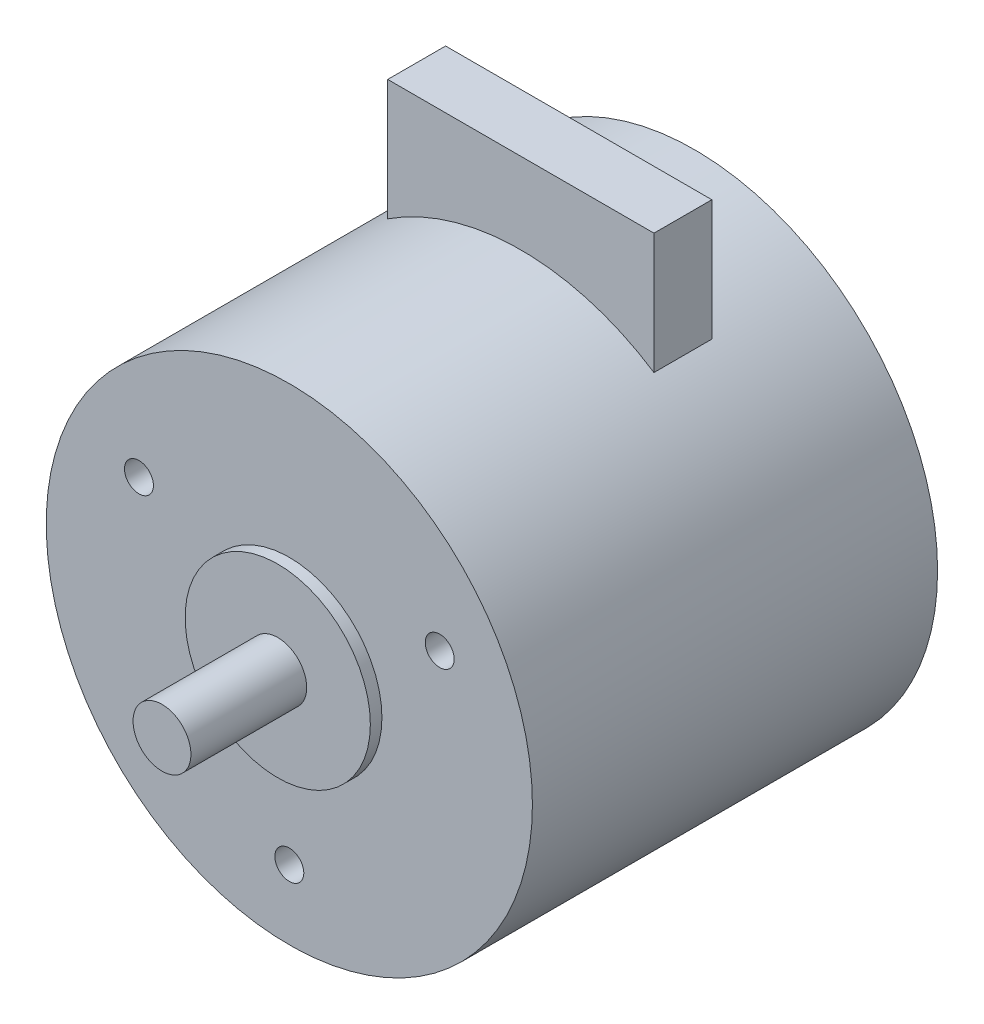
ISO-10303-21;
HEADER;
FILE_DESCRIPTION(('STEP AP214'),'2;1');
FILE_NAME('part.step','',(''),(''),'','','');
FILE_SCHEMA(('AUTOMOTIVE_DESIGN { 1 0 10303 214 1 1 1 1 }'));
ENDSEC;
DATA;
#1=APPLICATION_CONTEXT('core data for automotive mechanical design processes');
#2=APPLICATION_PROTOCOL_DEFINITION('international standard','automotive_design',2000,#1);
#3=PRODUCT_CONTEXT('',#1,'mechanical');
#4=PRODUCT('Part','Part','',(#3));
#5=PRODUCT_RELATED_PRODUCT_CATEGORY('part','',(#4));
#6=PRODUCT_DEFINITION_FORMATION('','',#4);
#7=PRODUCT_DEFINITION_CONTEXT('part definition',#1,'design');
#8=PRODUCT_DEFINITION('design','',#6,#7);
#9=PRODUCT_DEFINITION_SHAPE('','',#8);
#10=(LENGTH_UNIT() NAMED_UNIT(*) SI_UNIT(.MILLI.,.METRE.));
#11=(NAMED_UNIT(*) PLANE_ANGLE_UNIT() SI_UNIT($,.RADIAN.));
#12=(NAMED_UNIT(*) SI_UNIT($,.STERADIAN.) SOLID_ANGLE_UNIT());
#13=UNCERTAINTY_MEASURE_WITH_UNIT(LENGTH_MEASURE(1.E-05),#10,'distance_accuracy_value','');
#14=(GEOMETRIC_REPRESENTATION_CONTEXT(3) GLOBAL_UNCERTAINTY_ASSIGNED_CONTEXT((#13)) GLOBAL_UNIT_ASSIGNED_CONTEXT((#10,
#11,#12)) REPRESENTATION_CONTEXT('',''));
#15=CARTESIAN_POINT('',(0.,0.,0.));
#16=DIRECTION('',(0.,0.,1.));
#17=DIRECTION('',(1.,0.,0.));
#18=AXIS2_PLACEMENT_3D('',#15,#16,#17);
#19=CARTESIAN_POINT('',(0.,0.,35.));
#20=DIRECTION('',(0.,0.,-1.));
#21=DIRECTION('',(-1.,0.,0.));
#22=AXIS2_PLACEMENT_3D('',#19,#20,#21);
#23=CYLINDRICAL_SURFACE('',#22,21.);
#24=CARTESIAN_POINT('',(0.,0.,0.));
#25=DIRECTION('',(0.,0.,1.));
#26=DIRECTION('',(1.,0.,0.));
#27=AXIS2_PLACEMENT_3D('',#24,#25,#26);
#28=CIRCLE('',#27,21.);
#29=CARTESIAN_POINT('',(21.,0.,0.));
#30=VERTEX_POINT('',#29);
#31=EDGE_CURVE('E111',#30,#30,#28,.T.);
#32=ORIENTED_EDGE('',*,*,#31,.T.);
#33=EDGE_LOOP('',(#32));
#34=FACE_BOUND('',#33,.T.);
#35=CARTESIAN_POINT('',(0.,0.,35.));
#36=DIRECTION('',(0.,0.,1.));
#37=DIRECTION('',(1.,0.,0.));
#38=AXIS2_PLACEMENT_3D('',#35,#36,#37);
#39=CIRCLE('',#38,21.);
#40=CARTESIAN_POINT('',(21.,0.,35.));
#41=VERTEX_POINT('',#40);
#42=EDGE_CURVE('E114',#41,#41,#39,.T.);
#43=ORIENTED_EDGE('',*,*,#42,.F.);
#44=EDGE_LOOP('',(#43));
#45=FACE_BOUND('',#44,.T.);
#46=CARTESIAN_POINT('',(0.,0.,15.));
#47=DIRECTION('',(0.,0.,-1.));
#48=DIRECTION('',(-1.,0.,0.));
#49=AXIS2_PLACEMENT_3D('',#46,#47,#48);
#50=CIRCLE('',#49,21.);
#51=CARTESIAN_POINT('',(-11.5,17.5712833908056,15.));
#52=VERTEX_POINT('',#51);
#53=CARTESIAN_POINT('',(11.5,17.5712833908056,15.));
#54=VERTEX_POINT('',#53);
#55=EDGE_CURVE('E11',#52,#54,#50,.T.);
#56=ORIENTED_EDGE('',*,*,#55,.F.);
#57=DIRECTION('',(0.,0.,-1.));
#58=VECTOR('',#57,1.);
#59=CARTESIAN_POINT('',(-11.5,17.5712833908056,35.));
#60=LINE('',#59,#58);
#61=CARTESIAN_POINT('',(-11.5,17.5712833908056,10.));
#62=VERTEX_POINT('',#61);
#63=EDGE_CURVE('E54',#52,#62,#60,.T.);
#64=ORIENTED_EDGE('',*,*,#63,.T.);
#65=CARTESIAN_POINT('',(0.,0.,10.));
#66=DIRECTION('',(0.,0.,-1.));
#67=DIRECTION('',(-1.,0.,0.));
#68=AXIS2_PLACEMENT_3D('',#65,#66,#67);
#69=CIRCLE('',#68,21.);
#70=CARTESIAN_POINT('',(11.5,17.5712833908056,10.));
#71=VERTEX_POINT('',#70);
#72=EDGE_CURVE('E107',#62,#71,#69,.T.);
#73=ORIENTED_EDGE('',*,*,#72,.T.);
#74=DIRECTION('',(0.,0.,-1.));
#75=VECTOR('',#74,1.);
#76=CARTESIAN_POINT('',(11.5,17.5712833908056,35.));
#77=LINE('',#76,#75);
#78=EDGE_CURVE('E39',#71,#54,#77,.F.);
#79=ORIENTED_EDGE('',*,*,#78,.T.);
#80=EDGE_LOOP('',(#56,#64,#73,#79));
#81=FACE_BOUND('',#80,.T.);
#82=ADVANCED_FACE('F32',(#34,#45,#81),#23,.T.);
#83=CARTESIAN_POINT('',(0.,0.,35.));
#84=DIRECTION('',(0.,0.,1.));
#85=DIRECTION('',(1.,0.,0.));
#86=AXIS2_PLACEMENT_3D('',#83,#84,#85);
#87=PLANE('',#86);
#88=CARTESIAN_POINT('',(1.04744440165294E-13,-15.,35.));
#89=DIRECTION('',(0.,0.,1.));
#90=DIRECTION('',(1.,0.,0.));
#91=AXIS2_PLACEMENT_3D('',#88,#89,#90);
#92=CIRCLE('',#91,1.25);
#93=CARTESIAN_POINT('',(1.2500000000001,-15.,35.));
#94=VERTEX_POINT('',#93);
#95=EDGE_CURVE('E138',#94,#94,#92,.T.);
#96=ORIENTED_EDGE('',*,*,#95,.F.);
#97=EDGE_LOOP('',(#96));
#98=FACE_BOUND('',#97,.T.);
#99=CARTESIAN_POINT('',(-12.9903810567657,7.50000000000046,35.));
#100=DIRECTION('',(0.,0.,1.));
#101=DIRECTION('',(1.,0.,0.));
#102=AXIS2_PLACEMENT_3D('',#99,#100,#101);
#103=CIRCLE('',#102,1.24999999999932);
#104=CARTESIAN_POINT('',(-11.7403810567664,7.50000000000046,35.));
#105=VERTEX_POINT('',#104);
#106=EDGE_CURVE('E132',#105,#105,#103,.T.);
#107=ORIENTED_EDGE('',*,*,#106,.F.);
#108=EDGE_LOOP('',(#107));
#109=FACE_BOUND('',#108,.T.);
#110=CARTESIAN_POINT('',(12.9903810567675,7.49999999999955,35.));
#111=DIRECTION('',(0.,0.,1.));
#112=DIRECTION('',(1.,0.,0.));
#113=AXIS2_PLACEMENT_3D('',#110,#111,#112);
#114=CIRCLE('',#113,1.24999999999907);
#115=CARTESIAN_POINT('',(14.2403810567665,7.49999999999955,35.));
#116=VERTEX_POINT('',#115);
#117=EDGE_CURVE('E126',#116,#116,#114,.T.);
#118=ORIENTED_EDGE('',*,*,#117,.F.);
#119=EDGE_LOOP('',(#118));
#120=FACE_BOUND('',#119,.T.);
#121=CARTESIAN_POINT('',(0.,0.,35.));
#122=DIRECTION('',(0.,0.,1.));
#123=DIRECTION('',(1.,0.,0.));
#124=AXIS2_PLACEMENT_3D('',#121,#122,#123);
#125=CIRCLE('',#124,8.);
#126=CARTESIAN_POINT('',(8.,0.,35.));
#127=VERTEX_POINT('',#126);
#128=EDGE_CURVE('E108',#127,#127,#125,.T.);
#129=ORIENTED_EDGE('',*,*,#128,.F.);
#130=EDGE_LOOP('',(#129));
#131=FACE_BOUND('',#130,.T.);
#132=ORIENTED_EDGE('',*,*,#42,.T.);
#133=EDGE_LOOP('',(#132));
#134=FACE_BOUND('',#133,.T.);
#135=ADVANCED_FACE('F153',(#98,#109,#120,#131,#134),#87,.T.);
#136=CARTESIAN_POINT('',(0.,0.,0.));
#137=DIRECTION('',(0.,0.,1.));
#138=DIRECTION('',(1.,0.,0.));
#139=AXIS2_PLACEMENT_3D('',#136,#137,#138);
#140=PLANE('',#139);
#141=ORIENTED_EDGE('',*,*,#31,.F.);
#142=EDGE_LOOP('',(#141));
#143=FACE_BOUND('',#142,.T.);
#144=ADVANCED_FACE('F156',(#143),#140,.F.);
#145=CARTESIAN_POINT('',(0.,0.,36.));
#146=DIRECTION('',(0.,0.,-1.));
#147=DIRECTION('',(-1.,0.,0.));
#148=AXIS2_PLACEMENT_3D('',#145,#146,#147);
#149=CYLINDRICAL_SURFACE('',#148,8.);
#150=CARTESIAN_POINT('',(0.,0.,36.));
#151=DIRECTION('',(0.,0.,1.));
#152=DIRECTION('',(1.,0.,0.));
#153=AXIS2_PLACEMENT_3D('',#150,#151,#152);
#154=CIRCLE('',#153,8.);
#155=CARTESIAN_POINT('',(8.,0.,36.));
#156=VERTEX_POINT('',#155);
#157=EDGE_CURVE('E103',#156,#156,#154,.T.);
#158=ORIENTED_EDGE('',*,*,#157,.F.);
#159=EDGE_LOOP('',(#158));
#160=FACE_BOUND('',#159,.T.);
#161=ORIENTED_EDGE('',*,*,#128,.T.);
#162=EDGE_LOOP('',(#161));
#163=FACE_BOUND('',#162,.T.);
#164=ADVANCED_FACE('F174',(#160,#163),#149,.T.);
#165=CARTESIAN_POINT('',(0.,0.,36.));
#166=DIRECTION('',(0.,0.,1.));
#167=DIRECTION('',(1.,0.,0.));
#168=AXIS2_PLACEMENT_3D('',#165,#166,#167);
#169=PLANE('',#168);
#170=CARTESIAN_POINT('',(0.,0.,36.));
#171=DIRECTION('',(0.,0.,1.));
#172=DIRECTION('',(1.,0.,0.));
#173=AXIS2_PLACEMENT_3D('',#170,#171,#172);
#174=CIRCLE('',#173,2.5);
#175=CARTESIAN_POINT('',(2.5,0.,36.));
#176=VERTEX_POINT('',#175);
#177=EDGE_CURVE('E104',#176,#176,#174,.T.);
#178=ORIENTED_EDGE('',*,*,#177,.F.);
#179=EDGE_LOOP('',(#178));
#180=FACE_BOUND('',#179,.T.);
#181=ORIENTED_EDGE('',*,*,#157,.T.);
#182=EDGE_LOOP('',(#181));
#183=FACE_BOUND('',#182,.T.);
#184=ADVANCED_FACE('F178',(#180,#183),#169,.T.);
#185=CARTESIAN_POINT('',(0.,0.,46.));
#186=DIRECTION('',(0.,0.,-1.));
#187=DIRECTION('',(-1.,0.,0.));
#188=AXIS2_PLACEMENT_3D('',#185,#186,#187);
#189=CYLINDRICAL_SURFACE('',#188,2.5);
#190=CARTESIAN_POINT('',(0.,0.,46.));
#191=DIRECTION('',(0.,0.,1.));
#192=DIRECTION('',(1.,0.,0.));
#193=AXIS2_PLACEMENT_3D('',#190,#191,#192);
#194=CIRCLE('',#193,2.5);
#195=CARTESIAN_POINT('',(2.5,0.,46.));
#196=VERTEX_POINT('',#195);
#197=EDGE_CURVE('E99',#196,#196,#194,.T.);
#198=ORIENTED_EDGE('',*,*,#197,.F.);
#199=EDGE_LOOP('',(#198));
#200=FACE_BOUND('',#199,.T.);
#201=ORIENTED_EDGE('',*,*,#177,.T.);
#202=EDGE_LOOP('',(#201));
#203=FACE_BOUND('',#202,.T.);
#204=ADVANCED_FACE('F184',(#200,#203),#189,.T.);
#205=CARTESIAN_POINT('',(0.,0.,46.));
#206=DIRECTION('',(0.,0.,1.));
#207=DIRECTION('',(1.,0.,0.));
#208=AXIS2_PLACEMENT_3D('',#205,#206,#207);
#209=PLANE('',#208);
#210=ORIENTED_EDGE('',*,*,#197,.T.);
#211=EDGE_LOOP('',(#210));
#212=FACE_BOUND('',#211,.T.);
#213=ADVANCED_FACE('F188',(#212),#209,.T.);
#214=CARTESIAN_POINT('',(11.5,28.,15.));
#215=DIRECTION('',(1.,0.,0.));
#216=DIRECTION('',(0.,1.,0.));
#217=AXIS2_PLACEMENT_3D('',#214,#215,#216);
#218=PLANE('',#217);
#219=ORIENTED_EDGE('',*,*,#78,.F.);
#220=DIRECTION('',(0.,-1.,0.));
#221=VECTOR('',#220,1.);
#222=CARTESIAN_POINT('',(11.5,28.,10.));
#223=LINE('',#222,#221);
#224=CARTESIAN_POINT('',(11.5,28.,10.));
#225=VERTEX_POINT('',#224);
#226=EDGE_CURVE('E46',#225,#71,#223,.T.);
#227=ORIENTED_EDGE('',*,*,#226,.F.);
#228=DIRECTION('',(0.,0.,-1.));
#229=VECTOR('',#228,1.);
#230=CARTESIAN_POINT('',(11.5,28.,15.));
#231=LINE('',#230,#229);
#232=CARTESIAN_POINT('',(11.5,28.,15.));
#233=VERTEX_POINT('',#232);
#234=EDGE_CURVE('E86',#233,#225,#231,.T.);
#235=ORIENTED_EDGE('',*,*,#234,.F.);
#236=DIRECTION('',(0.,-1.,0.));
#237=VECTOR('',#236,1.);
#238=CARTESIAN_POINT('',(11.5,28.,15.));
#239=LINE('',#238,#237);
#240=EDGE_CURVE('E80',#233,#54,#239,.T.);
#241=ORIENTED_EDGE('',*,*,#240,.T.);
#242=EDGE_LOOP('',(#219,#227,#235,#241));
#243=FACE_BOUND('',#242,.T.);
#244=ADVANCED_FACE('F124',(#243),#218,.T.);
#245=CARTESIAN_POINT('',(-11.5,28.,15.));
#246=DIRECTION('',(-1.,0.,0.));
#247=DIRECTION('',(0.,-1.,0.));
#248=AXIS2_PLACEMENT_3D('',#245,#246,#247);
#249=PLANE('',#248);
#250=ORIENTED_EDGE('',*,*,#63,.F.);
#251=DIRECTION('',(0.,1.,0.));
#252=VECTOR('',#251,1.);
#253=CARTESIAN_POINT('',(-11.5,28.,15.));
#254=LINE('',#253,#252);
#255=CARTESIAN_POINT('',(-11.5,28.,15.));
#256=VERTEX_POINT('',#255);
#257=EDGE_CURVE('E71',#52,#256,#254,.T.);
#258=ORIENTED_EDGE('',*,*,#257,.T.);
#259=DIRECTION('',(0.,0.,-1.));
#260=VECTOR('',#259,1.);
#261=CARTESIAN_POINT('',(-11.5,28.,15.));
#262=LINE('',#261,#260);
#263=CARTESIAN_POINT('',(-11.5,28.,10.));
#264=VERTEX_POINT('',#263);
#265=EDGE_CURVE('E74',#256,#264,#262,.T.);
#266=ORIENTED_EDGE('',*,*,#265,.T.);
#267=DIRECTION('',(0.,1.,0.));
#268=VECTOR('',#267,1.);
#269=CARTESIAN_POINT('',(-11.5,28.,10.));
#270=LINE('',#269,#268);
#271=EDGE_CURVE('E95',#62,#264,#270,.T.);
#272=ORIENTED_EDGE('',*,*,#271,.F.);
#273=EDGE_LOOP('',(#250,#258,#266,#272));
#274=FACE_BOUND('',#273,.T.);
#275=ADVANCED_FACE('F73',(#274),#249,.T.);
#276=CARTESIAN_POINT('',(11.5,28.,15.));
#277=DIRECTION('',(0.,1.,0.));
#278=DIRECTION('',(0.,0.,1.));
#279=AXIS2_PLACEMENT_3D('',#276,#277,#278);
#280=PLANE('',#279);
#281=DIRECTION('',(1.,0.,0.));
#282=VECTOR('',#281,1.);
#283=CARTESIAN_POINT('',(11.5,28.,10.));
#284=LINE('',#283,#282);
#285=EDGE_CURVE('E85',#264,#225,#284,.T.);
#286=ORIENTED_EDGE('',*,*,#285,.F.);
#287=ORIENTED_EDGE('',*,*,#265,.F.);
#288=DIRECTION('',(1.,0.,0.));
#289=VECTOR('',#288,1.);
#290=CARTESIAN_POINT('',(11.5,28.,15.));
#291=LINE('',#290,#289);
#292=EDGE_CURVE('E79',#256,#233,#291,.T.);
#293=ORIENTED_EDGE('',*,*,#292,.T.);
#294=ORIENTED_EDGE('',*,*,#234,.T.);
#295=EDGE_LOOP('',(#286,#287,#293,#294));
#296=FACE_BOUND('',#295,.T.);
#297=ADVANCED_FACE('F84',(#296),#280,.T.);
#298=CARTESIAN_POINT('',(0.,0.,15.));
#299=DIRECTION('',(0.,0.,-1.));
#300=DIRECTION('',(-1.,0.,0.));
#301=AXIS2_PLACEMENT_3D('',#298,#299,#300);
#302=PLANE('',#301);
#303=ORIENTED_EDGE('',*,*,#257,.F.);
#304=ORIENTED_EDGE('',*,*,#55,.T.);
#305=ORIENTED_EDGE('',*,*,#240,.F.);
#306=ORIENTED_EDGE('',*,*,#292,.F.);
#307=EDGE_LOOP('',(#303,#304,#305,#306));
#308=FACE_BOUND('',#307,.T.);
#309=ADVANCED_FACE('F89',(#308),#302,.F.);
#310=CARTESIAN_POINT('',(0.,0.,10.));
#311=DIRECTION('',(0.,0.,-1.));
#312=DIRECTION('',(-1.,0.,0.));
#313=AXIS2_PLACEMENT_3D('',#310,#311,#312);
#314=PLANE('',#313);
#315=ORIENTED_EDGE('',*,*,#72,.F.);
#316=ORIENTED_EDGE('',*,*,#271,.T.);
#317=ORIENTED_EDGE('',*,*,#285,.T.);
#318=ORIENTED_EDGE('',*,*,#226,.T.);
#319=EDGE_LOOP('',(#315,#316,#317,#318));
#320=FACE_BOUND('',#319,.T.);
#321=ADVANCED_FACE('F199',(#320),#314,.T.);
#322=CARTESIAN_POINT('',(12.9903810567675,7.49999999999955,30.));
#323=DIRECTION('',(0.,0.,1.));
#324=DIRECTION('',(1.,0.,0.));
#325=AXIS2_PLACEMENT_3D('',#322,#323,#324);
#326=CYLINDRICAL_SURFACE('',#325,1.24999999999907);
#327=CARTESIAN_POINT('',(12.9903810567675,7.49999999999955,30.));
#328=DIRECTION('',(0.,0.,1.));
#329=DIRECTION('',(1.,0.,0.));
#330=AXIS2_PLACEMENT_3D('',#327,#328,#329);
#331=CIRCLE('',#330,1.24999999999907);
#332=CARTESIAN_POINT('',(14.2403810567665,7.49999999999955,30.));
#333=VERTEX_POINT('',#332);
#334=EDGE_CURVE('E129',#333,#333,#331,.T.);
#335=ORIENTED_EDGE('',*,*,#334,.F.);
#336=EDGE_LOOP('',(#335));
#337=FACE_BOUND('',#336,.T.);
#338=ORIENTED_EDGE('',*,*,#117,.T.);
#339=EDGE_LOOP('',(#338));
#340=FACE_BOUND('',#339,.T.);
#341=ADVANCED_FACE('F202',(#337,#340),#326,.F.);
#342=CARTESIAN_POINT('',(12.9903810567675,7.49999999999955,30.));
#343=DIRECTION('',(0.,0.,1.));
#344=DIRECTION('',(1.,0.,0.));
#345=AXIS2_PLACEMENT_3D('',#342,#343,#344);
#346=PLANE('',#345);
#347=ORIENTED_EDGE('',*,*,#334,.T.);
#348=EDGE_LOOP('',(#347));
#349=FACE_BOUND('',#348,.T.);
#350=ADVANCED_FACE('F207',(#349),#346,.T.);
#351=CARTESIAN_POINT('',(-12.9903810567657,7.50000000000046,30.));
#352=DIRECTION('',(0.,0.,1.));
#353=DIRECTION('',(1.,0.,0.));
#354=AXIS2_PLACEMENT_3D('',#351,#352,#353);
#355=CYLINDRICAL_SURFACE('',#354,1.24999999999932);
#356=CARTESIAN_POINT('',(-12.9903810567657,7.50000000000046,30.));
#357=DIRECTION('',(0.,0.,1.));
#358=DIRECTION('',(1.,0.,0.));
#359=AXIS2_PLACEMENT_3D('',#356,#357,#358);
#360=CIRCLE('',#359,1.24999999999932);
#361=CARTESIAN_POINT('',(-11.7403810567664,7.50000000000046,30.));
#362=VERTEX_POINT('',#361);
#363=EDGE_CURVE('E135',#362,#362,#360,.T.);
#364=ORIENTED_EDGE('',*,*,#363,.F.);
#365=EDGE_LOOP('',(#364));
#366=FACE_BOUND('',#365,.T.);
#367=ORIENTED_EDGE('',*,*,#106,.T.);
#368=EDGE_LOOP('',(#367));
#369=FACE_BOUND('',#368,.T.);
#370=ADVANCED_FACE('F211',(#366,#369),#355,.F.);
#371=CARTESIAN_POINT('',(-12.9903810567657,7.50000000000046,30.));
#372=DIRECTION('',(0.,0.,1.));
#373=DIRECTION('',(1.,0.,0.));
#374=AXIS2_PLACEMENT_3D('',#371,#372,#373);
#375=PLANE('',#374);
#376=ORIENTED_EDGE('',*,*,#363,.T.);
#377=EDGE_LOOP('',(#376));
#378=FACE_BOUND('',#377,.T.);
#379=ADVANCED_FACE('F149',(#378),#375,.T.);
#380=CARTESIAN_POINT('',(1.04744440165294E-13,-15.,30.));
#381=DIRECTION('',(0.,0.,1.));
#382=DIRECTION('',(1.,0.,0.));
#383=AXIS2_PLACEMENT_3D('',#380,#381,#382);
#384=CYLINDRICAL_SURFACE('',#383,1.25);
#385=CARTESIAN_POINT('',(1.04744440165294E-13,-15.,30.));
#386=DIRECTION('',(0.,0.,1.));
#387=DIRECTION('',(1.,0.,0.));
#388=AXIS2_PLACEMENT_3D('',#385,#386,#387);
#389=CIRCLE('',#388,1.25);
#390=CARTESIAN_POINT('',(1.2500000000001,-15.,30.));
#391=VERTEX_POINT('',#390);
#392=EDGE_CURVE('E96',#391,#391,#389,.T.);
#393=ORIENTED_EDGE('',*,*,#392,.F.);
#394=EDGE_LOOP('',(#393));
#395=FACE_BOUND('',#394,.T.);
#396=ORIENTED_EDGE('',*,*,#95,.T.);
#397=EDGE_LOOP('',(#396));
#398=FACE_BOUND('',#397,.T.);
#399=ADVANCED_FACE('F146',(#395,#398),#384,.F.);
#400=CARTESIAN_POINT('',(1.04744440165294E-13,-15.,30.));
#401=DIRECTION('',(0.,0.,1.));
#402=DIRECTION('',(1.,0.,0.));
#403=AXIS2_PLACEMENT_3D('',#400,#401,#402);
#404=PLANE('',#403);
#405=ORIENTED_EDGE('',*,*,#392,.T.);
#406=EDGE_LOOP('',(#405));
#407=FACE_BOUND('',#406,.T.);
#408=ADVANCED_FACE('F144',(#407),#404,.T.);
#409=CLOSED_SHELL('',(#82,#135,#144,#164,#184,#204,#213,#244,#275,#297,#309,#321,#341,#350,#370,
#379,#399,#408));
#410=MANIFOLD_SOLID_BREP('B2',#409);
#411=ADVANCED_BREP_SHAPE_REPRESENTATION('',(#18,#410),#14);
#412=SHAPE_DEFINITION_REPRESENTATION(#9,#411);
ENDSEC;
END-ISO-10303-21;
